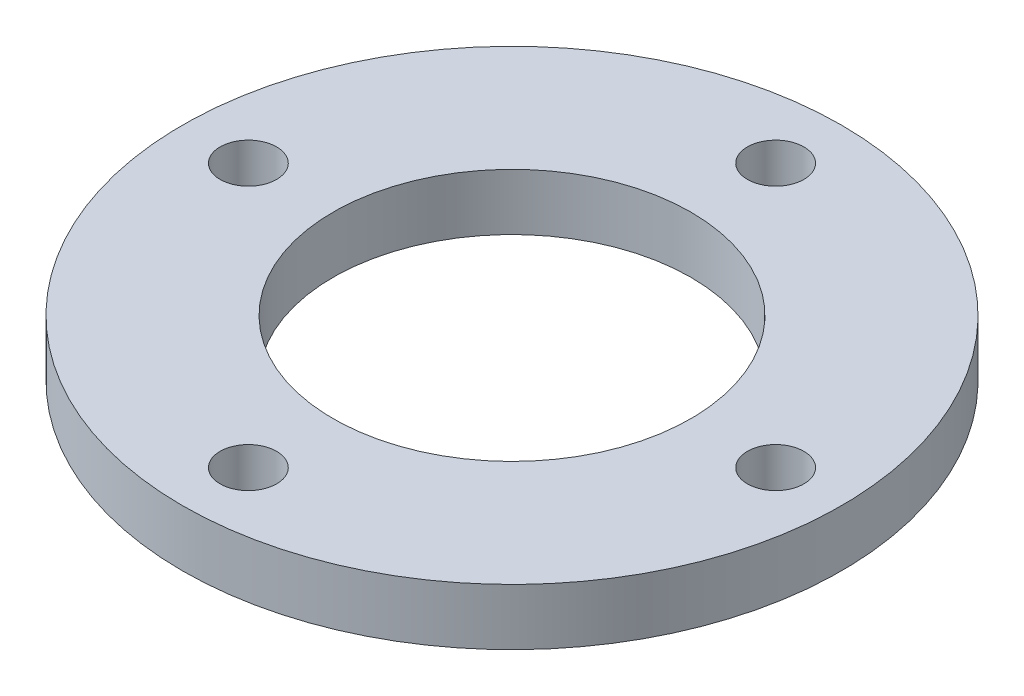
ISO-10303-21;
HEADER;
FILE_DESCRIPTION(('STEP AP214'),'2;1');
FILE_NAME('part.step','',(''),(''),'','','');
FILE_SCHEMA(('AUTOMOTIVE_DESIGN { 1 0 10303 214 1 1 1 1 }'));
ENDSEC;
DATA;
#1=APPLICATION_CONTEXT('core data for automotive mechanical design processes');
#2=APPLICATION_PROTOCOL_DEFINITION('international standard','automotive_design',2000,#1);
#3=PRODUCT_CONTEXT('',#1,'mechanical');
#4=PRODUCT('Part','Part','',(#3));
#5=PRODUCT_RELATED_PRODUCT_CATEGORY('part','',(#4));
#6=PRODUCT_DEFINITION_FORMATION('','',#4);
#7=PRODUCT_DEFINITION_CONTEXT('part definition',#1,'design');
#8=PRODUCT_DEFINITION('design','',#6,#7);
#9=PRODUCT_DEFINITION_SHAPE('','',#8);
#10=(LENGTH_UNIT() NAMED_UNIT(*) SI_UNIT(.MILLI.,.METRE.));
#11=(NAMED_UNIT(*) PLANE_ANGLE_UNIT() SI_UNIT($,.RADIAN.));
#12=(NAMED_UNIT(*) SI_UNIT($,.STERADIAN.) SOLID_ANGLE_UNIT());
#13=UNCERTAINTY_MEASURE_WITH_UNIT(LENGTH_MEASURE(1.E-05),#10,'distance_accuracy_value','');
#14=(GEOMETRIC_REPRESENTATION_CONTEXT(3) GLOBAL_UNCERTAINTY_ASSIGNED_CONTEXT((#13)) GLOBAL_UNIT_ASSIGNED_CONTEXT((#10,
#11,#12)) REPRESENTATION_CONTEXT('',''));
#15=CARTESIAN_POINT('',(0.,0.,0.));
#16=DIRECTION('',(0.,0.,1.));
#17=DIRECTION('',(1.,0.,0.));
#18=AXIS2_PLACEMENT_3D('',#15,#16,#17);
#19=CARTESIAN_POINT('',(0.,0.,0.));
#20=DIRECTION('',(0.,1.,0.));
#21=DIRECTION('',(0.,0.,1.));
#22=AXIS2_PLACEMENT_3D('',#19,#20,#21);
#23=PLANE('',#22);
#24=CARTESIAN_POINT('',(0.,0.,0.));
#25=DIRECTION('',(0.,-1.,0.));
#26=DIRECTION('',(0.,0.,-1.));
#27=AXIS2_PLACEMENT_3D('',#24,#25,#26);
#28=CIRCLE('',#27,9.5);
#29=CARTESIAN_POINT('',(0.,0.,-9.5));
#30=VERTEX_POINT('',#29);
#31=EDGE_CURVE('E41',#30,#30,#28,.F.);
#32=ORIENTED_EDGE('',*,*,#31,.T.);
#33=EDGE_LOOP('',(#32));
#34=FACE_BOUND('',#33,.T.);
#35=CARTESIAN_POINT('',(0.,0.,0.));
#36=DIRECTION('',(0.,-1.,0.));
#37=DIRECTION('',(0.,0.,-1.));
#38=AXIS2_PLACEMENT_3D('',#35,#36,#37);
#39=CIRCLE('',#38,17.5);
#40=CARTESIAN_POINT('',(0.,0.,-17.5));
#41=VERTEX_POINT('',#40);
#42=EDGE_CURVE('E44',#41,#41,#39,.F.);
#43=ORIENTED_EDGE('',*,*,#42,.F.);
#44=EDGE_LOOP('',(#43));
#45=FACE_BOUND('',#44,.T.);
#46=CARTESIAN_POINT('',(-14.,0.,0.));
#47=DIRECTION('',(0.,1.,0.));
#48=DIRECTION('',(0.,0.,1.));
#49=AXIS2_PLACEMENT_3D('',#46,#47,#48);
#50=CIRCLE('',#49,1.5);
#51=CARTESIAN_POINT('',(-14.,0.,1.5));
#52=VERTEX_POINT('',#51);
#53=EDGE_CURVE('E47',#52,#52,#50,.T.);
#54=ORIENTED_EDGE('',*,*,#53,.T.);
#55=EDGE_LOOP('',(#54));
#56=FACE_BOUND('',#55,.T.);
#57=CARTESIAN_POINT('',(14.,0.,0.));
#58=DIRECTION('',(0.,1.,0.));
#59=DIRECTION('',(0.,0.,1.));
#60=AXIS2_PLACEMENT_3D('',#57,#58,#59);
#61=CIRCLE('',#60,1.5);
#62=CARTESIAN_POINT('',(14.,0.,1.5));
#63=VERTEX_POINT('',#62);
#64=EDGE_CURVE('E50',#63,#63,#61,.T.);
#65=ORIENTED_EDGE('',*,*,#64,.T.);
#66=EDGE_LOOP('',(#65));
#67=FACE_BOUND('',#66,.T.);
#68=CARTESIAN_POINT('',(0.,0.,14.));
#69=DIRECTION('',(0.,1.,0.));
#70=DIRECTION('',(0.,0.,1.));
#71=AXIS2_PLACEMENT_3D('',#68,#69,#70);
#72=CIRCLE('',#71,1.5);
#73=CARTESIAN_POINT('',(0.,0.,15.5));
#74=VERTEX_POINT('',#73);
#75=EDGE_CURVE('E52',#74,#74,#72,.T.);
#76=ORIENTED_EDGE('',*,*,#75,.T.);
#77=EDGE_LOOP('',(#76));
#78=FACE_BOUND('',#77,.T.);
#79=CARTESIAN_POINT('',(0.,0.,-14.));
#80=DIRECTION('',(0.,1.,0.));
#81=DIRECTION('',(0.,0.,1.));
#82=AXIS2_PLACEMENT_3D('',#79,#80,#81);
#83=CIRCLE('',#82,1.5);
#84=CARTESIAN_POINT('',(0.,0.,-12.5));
#85=VERTEX_POINT('',#84);
#86=EDGE_CURVE('E18',#85,#85,#83,.T.);
#87=ORIENTED_EDGE('',*,*,#86,.T.);
#88=EDGE_LOOP('',(#87));
#89=FACE_BOUND('',#88,.T.);
#90=ADVANCED_FACE('F15',(#34,#45,#56,#67,#78,#89),#23,.F.);
#91=CARTESIAN_POINT('',(0.,3.,-14.));
#92=DIRECTION('',(0.,1.,0.));
#93=DIRECTION('',(0.,0.,1.));
#94=AXIS2_PLACEMENT_3D('',#91,#92,#93);
#95=CYLINDRICAL_SURFACE('',#94,1.5);
#96=CARTESIAN_POINT('',(0.,3.,-14.));
#97=DIRECTION('',(0.,1.,0.));
#98=DIRECTION('',(0.,0.,1.));
#99=AXIS2_PLACEMENT_3D('',#96,#97,#98);
#100=CIRCLE('',#99,1.5);
#101=CARTESIAN_POINT('',(0.,3.,-12.5));
#102=VERTEX_POINT('',#101);
#103=EDGE_CURVE('E38',#102,#102,#100,.F.);
#104=ORIENTED_EDGE('',*,*,#103,.F.);
#105=EDGE_LOOP('',(#104));
#106=FACE_BOUND('',#105,.T.);
#107=ORIENTED_EDGE('',*,*,#86,.F.);
#108=EDGE_LOOP('',(#107));
#109=FACE_BOUND('',#108,.T.);
#110=ADVANCED_FACE('F60',(#106,#109),#95,.F.);
#111=CARTESIAN_POINT('',(0.,3.,14.));
#112=DIRECTION('',(0.,1.,0.));
#113=DIRECTION('',(0.,0.,1.));
#114=AXIS2_PLACEMENT_3D('',#111,#112,#113);
#115=CYLINDRICAL_SURFACE('',#114,1.5);
#116=CARTESIAN_POINT('',(0.,3.,14.));
#117=DIRECTION('',(0.,1.,0.));
#118=DIRECTION('',(0.,0.,1.));
#119=AXIS2_PLACEMENT_3D('',#116,#117,#118);
#120=CIRCLE('',#119,1.5);
#121=CARTESIAN_POINT('',(0.,3.,15.5));
#122=VERTEX_POINT('',#121);
#123=EDGE_CURVE('E35',#122,#122,#120,.F.);
#124=ORIENTED_EDGE('',*,*,#123,.F.);
#125=EDGE_LOOP('',(#124));
#126=FACE_BOUND('',#125,.T.);
#127=ORIENTED_EDGE('',*,*,#75,.F.);
#128=EDGE_LOOP('',(#127));
#129=FACE_BOUND('',#128,.T.);
#130=ADVANCED_FACE('F62',(#126,#129),#115,.F.);
#131=CARTESIAN_POINT('',(14.,3.,0.));
#132=DIRECTION('',(0.,1.,0.));
#133=DIRECTION('',(0.,0.,1.));
#134=AXIS2_PLACEMENT_3D('',#131,#132,#133);
#135=CYLINDRICAL_SURFACE('',#134,1.5);
#136=CARTESIAN_POINT('',(14.,3.,0.));
#137=DIRECTION('',(0.,1.,0.));
#138=DIRECTION('',(0.,0.,1.));
#139=AXIS2_PLACEMENT_3D('',#136,#137,#138);
#140=CIRCLE('',#139,1.5);
#141=CARTESIAN_POINT('',(14.,3.,1.5));
#142=VERTEX_POINT('',#141);
#143=EDGE_CURVE('E32',#142,#142,#140,.F.);
#144=ORIENTED_EDGE('',*,*,#143,.F.);
#145=EDGE_LOOP('',(#144));
#146=FACE_BOUND('',#145,.T.);
#147=ORIENTED_EDGE('',*,*,#64,.F.);
#148=EDGE_LOOP('',(#147));
#149=FACE_BOUND('',#148,.T.);
#150=ADVANCED_FACE('F69',(#146,#149),#135,.F.);
#151=CARTESIAN_POINT('',(-14.,3.,0.));
#152=DIRECTION('',(0.,1.,0.));
#153=DIRECTION('',(0.,0.,1.));
#154=AXIS2_PLACEMENT_3D('',#151,#152,#153);
#155=CYLINDRICAL_SURFACE('',#154,1.5);
#156=CARTESIAN_POINT('',(-14.,3.,0.));
#157=DIRECTION('',(0.,1.,0.));
#158=DIRECTION('',(0.,0.,1.));
#159=AXIS2_PLACEMENT_3D('',#156,#157,#158);
#160=CIRCLE('',#159,1.5);
#161=CARTESIAN_POINT('',(-14.,3.,1.5));
#162=VERTEX_POINT('',#161);
#163=EDGE_CURVE('E27',#162,#162,#160,.F.);
#164=ORIENTED_EDGE('',*,*,#163,.F.);
#165=EDGE_LOOP('',(#164));
#166=FACE_BOUND('',#165,.T.);
#167=ORIENTED_EDGE('',*,*,#53,.F.);
#168=EDGE_LOOP('',(#167));
#169=FACE_BOUND('',#168,.T.);
#170=ADVANCED_FACE('F88',(#166,#169),#155,.F.);
#171=CARTESIAN_POINT('',(0.,3.,0.));
#172=DIRECTION('',(0.,-1.,0.));
#173=DIRECTION('',(0.,0.,-1.));
#174=AXIS2_PLACEMENT_3D('',#171,#172,#173);
#175=CYLINDRICAL_SURFACE('',#174,17.5);
#176=ORIENTED_EDGE('',*,*,#42,.T.);
#177=EDGE_LOOP('',(#176));
#178=FACE_BOUND('',#177,.T.);
#179=CARTESIAN_POINT('',(0.,3.,0.));
#180=DIRECTION('',(0.,-1.,0.));
#181=DIRECTION('',(0.,0.,-1.));
#182=AXIS2_PLACEMENT_3D('',#179,#180,#181);
#183=CIRCLE('',#182,17.5);
#184=CARTESIAN_POINT('',(0.,3.,-17.5));
#185=VERTEX_POINT('',#184);
#186=EDGE_CURVE('E22',#185,#185,#183,.F.);
#187=ORIENTED_EDGE('',*,*,#186,.F.);
#188=EDGE_LOOP('',(#187));
#189=FACE_BOUND('',#188,.T.);
#190=ADVANCED_FACE('F81',(#178,#189),#175,.T.);
#191=CARTESIAN_POINT('',(0.,3.,0.));
#192=DIRECTION('',(0.,-1.,0.));
#193=DIRECTION('',(0.,0.,-1.));
#194=AXIS2_PLACEMENT_3D('',#191,#192,#193);
#195=CYLINDRICAL_SURFACE('',#194,9.5);
#196=CARTESIAN_POINT('',(0.,3.,0.));
#197=DIRECTION('',(0.,-1.,0.));
#198=DIRECTION('',(0.,0.,-1.));
#199=AXIS2_PLACEMENT_3D('',#196,#197,#198);
#200=CIRCLE('',#199,9.5);
#201=CARTESIAN_POINT('',(0.,3.,-9.5));
#202=VERTEX_POINT('',#201);
#203=EDGE_CURVE('E10',#202,#202,#200,.T.);
#204=ORIENTED_EDGE('',*,*,#203,.F.);
#205=EDGE_LOOP('',(#204));
#206=FACE_BOUND('',#205,.T.);
#207=ORIENTED_EDGE('',*,*,#31,.F.);
#208=EDGE_LOOP('',(#207));
#209=FACE_BOUND('',#208,.T.);
#210=ADVANCED_FACE('F76',(#206,#209),#195,.F.);
#211=CARTESIAN_POINT('',(0.,3.,0.));
#212=DIRECTION('',(0.,1.,0.));
#213=DIRECTION('',(0.,0.,1.));
#214=AXIS2_PLACEMENT_3D('',#211,#212,#213);
#215=PLANE('',#214);
#216=ORIENTED_EDGE('',*,*,#203,.T.);
#217=EDGE_LOOP('',(#216));
#218=FACE_BOUND('',#217,.T.);
#219=ORIENTED_EDGE('',*,*,#186,.T.);
#220=EDGE_LOOP('',(#219));
#221=FACE_BOUND('',#220,.T.);
#222=ORIENTED_EDGE('',*,*,#163,.T.);
#223=EDGE_LOOP('',(#222));
#224=FACE_BOUND('',#223,.T.);
#225=ORIENTED_EDGE('',*,*,#143,.T.);
#226=EDGE_LOOP('',(#225));
#227=FACE_BOUND('',#226,.T.);
#228=ORIENTED_EDGE('',*,*,#123,.T.);
#229=EDGE_LOOP('',(#228));
#230=FACE_BOUND('',#229,.T.);
#231=ORIENTED_EDGE('',*,*,#103,.T.);
#232=EDGE_LOOP('',(#231));
#233=FACE_BOUND('',#232,.T.);
#234=ADVANCED_FACE('F74',(#218,#221,#224,#227,#230,#233),#215,.T.);
#235=CLOSED_SHELL('',(#90,#110,#130,#150,#170,#190,#210,#234));
#236=MANIFOLD_SOLID_BREP('B1',#235);
#237=ADVANCED_BREP_SHAPE_REPRESENTATION('',(#18,#236),#14);
#238=SHAPE_DEFINITION_REPRESENTATION(#9,#237);
ENDSEC;
END-ISO-10303-21;
